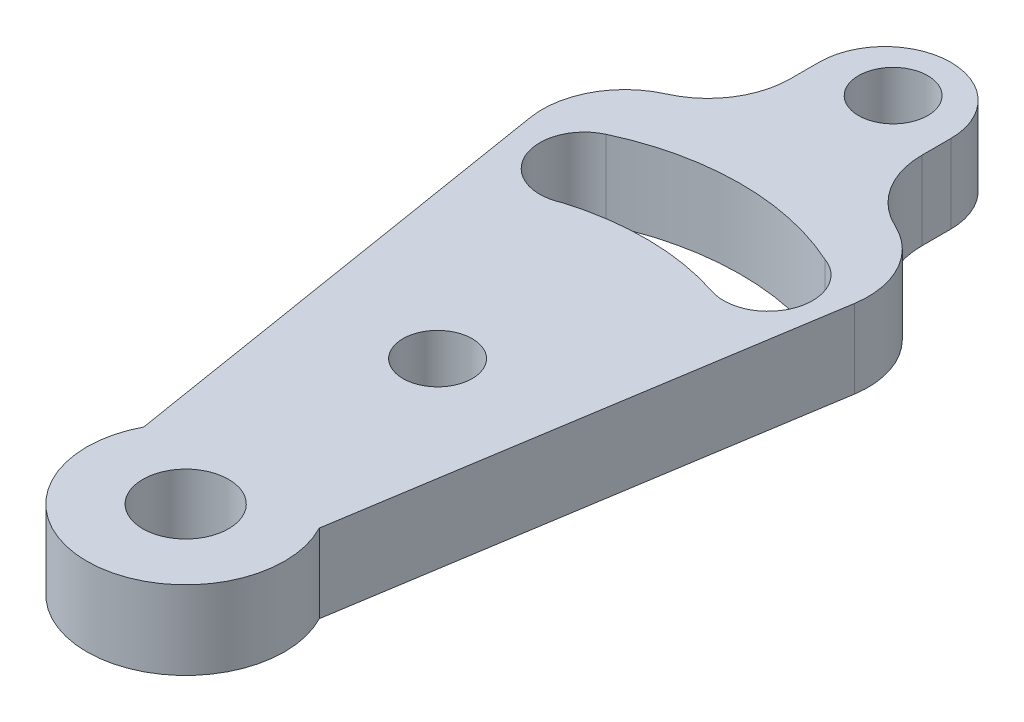
ISO-10303-21;
HEADER;
FILE_DESCRIPTION(('STEP AP214'),'2;1');
FILE_NAME('part.step','',(''),(''),'','','');
FILE_SCHEMA(('AUTOMOTIVE_DESIGN { 1 0 10303 214 1 1 1 1 }'));
ENDSEC;
DATA;
#1=APPLICATION_CONTEXT('core data for automotive mechanical design processes');
#2=APPLICATION_PROTOCOL_DEFINITION('international standard','automotive_design',2000,#1);
#3=PRODUCT_CONTEXT('',#1,'mechanical');
#4=PRODUCT('Part','Part','',(#3));
#5=PRODUCT_RELATED_PRODUCT_CATEGORY('part','',(#4));
#6=PRODUCT_DEFINITION_FORMATION('','',#4);
#7=PRODUCT_DEFINITION_CONTEXT('part definition',#1,'design');
#8=PRODUCT_DEFINITION('design','',#6,#7);
#9=PRODUCT_DEFINITION_SHAPE('','',#8);
#10=(LENGTH_UNIT() NAMED_UNIT(*) SI_UNIT(.MILLI.,.METRE.));
#11=(NAMED_UNIT(*) PLANE_ANGLE_UNIT() SI_UNIT($,.RADIAN.));
#12=(NAMED_UNIT(*) SI_UNIT($,.STERADIAN.) SOLID_ANGLE_UNIT());
#13=UNCERTAINTY_MEASURE_WITH_UNIT(LENGTH_MEASURE(1.E-05),#10,'distance_accuracy_value','');
#14=(GEOMETRIC_REPRESENTATION_CONTEXT(3) GLOBAL_UNCERTAINTY_ASSIGNED_CONTEXT((#13)) GLOBAL_UNIT_ASSIGNED_CONTEXT((#10,
#11,#12)) REPRESENTATION_CONTEXT('',''));
#15=CARTESIAN_POINT('',(0.,0.,0.));
#16=DIRECTION('',(0.,0.,1.));
#17=DIRECTION('',(1.,0.,0.));
#18=AXIS2_PLACEMENT_3D('',#15,#16,#17);
#19=CARTESIAN_POINT('',(-18.8482791708787,2279.62390973945,-526.663757324218));
#20=DIRECTION('',(0.,-1.,0.));
#21=DIRECTION('',(1.,0.,0.));
#22=AXIS2_PLACEMENT_3D('',#19,#20,#21);
#23=CYLINDRICAL_SURFACE('',#22,4.);
#24=CARTESIAN_POINT('',(-18.8482791708786,2274.86140973945,-526.663757324218));
#25=DIRECTION('',(0.,-1.,0.));
#26=DIRECTION('',(1.,0.,0.));
#27=AXIS2_PLACEMENT_3D('',#24,#25,#26);
#28=CIRCLE('',#27,4.);
#29=CARTESIAN_POINT('',(-22.8482791708786,2274.86140973945,-526.663757324218));
#30=VERTEX_POINT('',#29);
#31=CARTESIAN_POINT('',(-14.8482791708786,2274.86140973945,-526.663757324218));
#32=VERTEX_POINT('',#31);
#33=EDGE_CURVE('E171',#30,#32,#28,.T.);
#34=ORIENTED_EDGE('',*,*,#33,.F.);
#35=DIRECTION('',(0.,-1.,0.));
#36=VECTOR('',#35,1.);
#37=CARTESIAN_POINT('',(-22.8482791708787,2279.62390973945,-526.663757324218));
#38=LINE('',#37,#36);
#39=CARTESIAN_POINT('',(-22.8482791708787,2279.62390973945,-526.663757324218));
#40=VERTEX_POINT('',#39);
#41=EDGE_CURVE('E11',#40,#30,#38,.T.);
#42=ORIENTED_EDGE('',*,*,#41,.F.);
#43=CARTESIAN_POINT('',(-18.8482791708787,2279.62390973945,-526.663757324218));
#44=DIRECTION('',(0.,-1.,0.));
#45=DIRECTION('',(1.,0.,0.));
#46=AXIS2_PLACEMENT_3D('',#43,#44,#45);
#47=CIRCLE('',#46,4.);
#48=CARTESIAN_POINT('',(-14.8482791708787,2279.62390973945,-526.663757324218));
#49=VERTEX_POINT('',#48);
#50=EDGE_CURVE('E175',#40,#49,#47,.T.);
#51=ORIENTED_EDGE('',*,*,#50,.T.);
#52=DIRECTION('',(0.,-1.,0.));
#53=VECTOR('',#52,1.);
#54=CARTESIAN_POINT('',(-14.8482791708787,2279.62390973945,-526.663757324218));
#55=LINE('',#54,#53);
#56=EDGE_CURVE('E37',#49,#32,#55,.T.);
#57=ORIENTED_EDGE('',*,*,#56,.T.);
#58=EDGE_LOOP('',(#34,#42,#51,#57));
#59=FACE_BOUND('',#58,.T.);
#60=ADVANCED_FACE('F34',(#59),#23,.T.);
#61=CARTESIAN_POINT('',(-22.8482791708787,2279.62390973945,-524.940713696492));
#62=DIRECTION('',(-1.,0.,0.));
#63=DIRECTION('',(0.,-1.,0.));
#64=AXIS2_PLACEMENT_3D('',#61,#62,#63);
#65=PLANE('',#64);
#66=DIRECTION('',(0.,0.,-1.));
#67=VECTOR('',#66,1.);
#68=CARTESIAN_POINT('',(-22.8482791708786,2274.86140973945,-524.940713696492));
#69=LINE('',#68,#67);
#70=CARTESIAN_POINT('',(-22.8482791708787,2274.86140973945,-524.940713696492));
#71=VERTEX_POINT('',#70);
#72=EDGE_CURVE('E179',#71,#30,#69,.T.);
#73=ORIENTED_EDGE('',*,*,#72,.F.);
#74=DIRECTION('',(0.,-1.,0.));
#75=VECTOR('',#74,1.);
#76=CARTESIAN_POINT('',(-22.8482791708787,2279.62390973945,-524.940713696492));
#77=LINE('',#76,#75);
#78=CARTESIAN_POINT('',(-22.8482791708787,2279.62390973945,-524.940713696492));
#79=VERTEX_POINT('',#78);
#80=EDGE_CURVE('E42',#79,#71,#77,.T.);
#81=ORIENTED_EDGE('',*,*,#80,.F.);
#82=DIRECTION('',(0.,0.,-1.));
#83=VECTOR('',#82,1.);
#84=CARTESIAN_POINT('',(-22.8482791708787,2279.62390973945,-524.940713696492));
#85=LINE('',#84,#83);
#86=EDGE_CURVE('E203',#79,#40,#85,.T.);
#87=ORIENTED_EDGE('',*,*,#86,.T.);
#88=ORIENTED_EDGE('',*,*,#41,.T.);
#89=EDGE_LOOP('',(#73,#81,#87,#88));
#90=FACE_BOUND('',#89,.T.);
#91=ADVANCED_FACE('F258',(#90),#65,.T.);
#92=CARTESIAN_POINT('',(-27.8482791708787,2279.62390973945,-524.940713696492));
#93=DIRECTION('',(0.,-1.,0.));
#94=DIRECTION('',(1.,0.,0.));
#95=AXIS2_PLACEMENT_3D('',#92,#93,#94);
#96=CYLINDRICAL_SURFACE('',#95,4.99999999999991);
#97=CARTESIAN_POINT('',(-27.8482791708786,2274.86140973945,-524.940713696492));
#98=DIRECTION('',(0.,1.,0.));
#99=DIRECTION('',(-1.,0.,0.));
#100=AXIS2_PLACEMENT_3D('',#97,#98,#99);
#101=CIRCLE('',#100,4.99999999999991);
#102=CARTESIAN_POINT('',(-25.8079527000328,2274.86140973945,-520.375949968503));
#103=VERTEX_POINT('',#102);
#104=EDGE_CURVE('E229',#103,#71,#101,.T.);
#105=ORIENTED_EDGE('',*,*,#104,.F.);
#106=DIRECTION('',(0.,-1.,0.));
#107=VECTOR('',#106,1.);
#108=CARTESIAN_POINT('',(-25.8079527000328,2279.62390973945,-520.375949968503));
#109=LINE('',#108,#107);
#110=CARTESIAN_POINT('',(-25.8079527000328,2279.62390973945,-520.375949968503));
#111=VERTEX_POINT('',#110);
#112=EDGE_CURVE('E235',#111,#103,#109,.T.);
#113=ORIENTED_EDGE('',*,*,#112,.F.);
#114=CARTESIAN_POINT('',(-27.8482791708787,2279.62390973945,-524.940713696492));
#115=DIRECTION('',(0.,1.,0.));
#116=DIRECTION('',(-1.,0.,0.));
#117=AXIS2_PLACEMENT_3D('',#114,#115,#116);
#118=CIRCLE('',#117,4.99999999999991);
#119=EDGE_CURVE('E200',#111,#79,#118,.T.);
#120=ORIENTED_EDGE('',*,*,#119,.T.);
#121=ORIENTED_EDGE('',*,*,#80,.T.);
#122=EDGE_LOOP('',(#105,#113,#120,#121));
#123=FACE_BOUND('',#122,.T.);
#124=ADVANCED_FACE('F287',(#123),#96,.F.);
#125=CARTESIAN_POINT('',(-23.767626229187,2279.62390973945,-515.811186240514));
#126=DIRECTION('',(0.,-1.,0.));
#127=DIRECTION('',(1.,0.,0.));
#128=AXIS2_PLACEMENT_3D('',#125,#126,#127);
#129=CYLINDRICAL_SURFACE('',#128,4.99999999999992);
#130=CARTESIAN_POINT('',(-23.7676262291869,2274.86140973945,-515.811186240514));
#131=DIRECTION('',(0.,-1.,0.));
#132=DIRECTION('',(1.,0.,0.));
#133=AXIS2_PLACEMENT_3D('',#130,#131,#132);
#134=CIRCLE('',#133,4.99999999999992);
#135=CARTESIAN_POINT('',(-28.7031764289429,2274.86140973945,-515.010971128379));
#136=VERTEX_POINT('',#135);
#137=EDGE_CURVE('E226',#136,#103,#134,.T.);
#138=ORIENTED_EDGE('',*,*,#137,.F.);
#139=DIRECTION('',(0.,-1.,0.));
#140=VECTOR('',#139,1.);
#141=CARTESIAN_POINT('',(-28.703176428943,2279.62390973945,-515.010971128379));
#142=LINE('',#141,#140);
#143=CARTESIAN_POINT('',(-28.703176428943,2279.62390973945,-515.010971128379));
#144=VERTEX_POINT('',#143);
#145=EDGE_CURVE('E237',#144,#136,#142,.T.);
#146=ORIENTED_EDGE('',*,*,#145,.F.);
#147=CARTESIAN_POINT('',(-23.767626229187,2279.62390973945,-515.811186240514));
#148=DIRECTION('',(0.,-1.,0.));
#149=DIRECTION('',(1.,0.,0.));
#150=AXIS2_PLACEMENT_3D('',#147,#148,#149);
#151=CIRCLE('',#150,4.99999999999992);
#152=EDGE_CURVE('E197',#144,#111,#151,.T.);
#153=ORIENTED_EDGE('',*,*,#152,.T.);
#154=ORIENTED_EDGE('',*,*,#112,.T.);
#155=EDGE_LOOP('',(#138,#146,#153,#154));
#156=FACE_BOUND('',#155,.T.);
#157=ADVANCED_FACE('F285',(#156),#129,.T.);
#158=CARTESIAN_POINT('',(-24.1679375729257,2279.62390973945,-487.0386188167));
#159=DIRECTION('',(-0.987110039951201,0.,0.160043022426906));
#160=DIRECTION('',(0.160043022426906,0.,0.987110039951201));
#161=AXIS2_PLACEMENT_3D('',#158,#159,#160);
#162=PLANE('',#161);
#163=DIRECTION('',(-0.160043022426906,0.,-0.987110039951201));
#164=VECTOR('',#163,1.);
#165=CARTESIAN_POINT('',(-24.1679375729257,2274.86140973945,-487.0386188167));
#166=LINE('',#165,#164);
#167=CARTESIAN_POINT('',(-24.1679375729257,2274.86140973945,-487.0386188167));
#168=VERTEX_POINT('',#167);
#169=EDGE_CURVE('E223',#168,#136,#166,.T.);
#170=ORIENTED_EDGE('',*,*,#169,.F.);
#171=DIRECTION('',(0.,-1.,0.));
#172=VECTOR('',#171,1.);
#173=CARTESIAN_POINT('',(-24.1679375729257,2279.62390973945,-487.0386188167));
#174=LINE('',#173,#172);
#175=CARTESIAN_POINT('',(-24.1679375729257,2279.62390973945,-487.0386188167));
#176=VERTEX_POINT('',#175);
#177=EDGE_CURVE('E239',#176,#168,#174,.T.);
#178=ORIENTED_EDGE('',*,*,#177,.F.);
#179=DIRECTION('',(-0.160043022426906,0.,-0.987110039951201));
#180=VECTOR('',#179,1.);
#181=CARTESIAN_POINT('',(-24.1679375729257,2279.62390973945,-487.0386188167));
#182=LINE('',#181,#180);
#183=EDGE_CURVE('E194',#176,#144,#182,.T.);
#184=ORIENTED_EDGE('',*,*,#183,.T.);
#185=ORIENTED_EDGE('',*,*,#145,.T.);
#186=EDGE_LOOP('',(#170,#178,#184,#185));
#187=FACE_BOUND('',#186,.T.);
#188=ADVANCED_FACE('F281',(#187),#162,.T.);
#189=CARTESIAN_POINT('',(-18.8482791708787,2279.62390973945,-484.26350900166));
#190=DIRECTION('',(0.,-1.,0.));
#191=DIRECTION('',(1.,0.,0.));
#192=AXIS2_PLACEMENT_3D('',#189,#190,#191);
#193=CYLINDRICAL_SURFACE('',#192,6.00000000000001);
#194=CARTESIAN_POINT('',(-18.8482791708786,2274.86140973945,-484.26350900166));
#195=DIRECTION('',(0.,-1.,0.));
#196=DIRECTION('',(1.,0.,0.));
#197=AXIS2_PLACEMENT_3D('',#194,#195,#196);
#198=CIRCLE('',#197,6.00000000000001);
#199=CARTESIAN_POINT('',(-13.5369203045615,2274.86140973945,-487.054470662664));
#200=VERTEX_POINT('',#199);
#201=EDGE_CURVE('E220',#200,#168,#198,.T.);
#202=ORIENTED_EDGE('',*,*,#201,.F.);
#203=DIRECTION('',(0.,-1.,0.));
#204=VECTOR('',#203,1.);
#205=CARTESIAN_POINT('',(-13.5369203045615,2279.62390973945,-487.054470662664));
#206=LINE('',#205,#204);
#207=CARTESIAN_POINT('',(-13.5369203045615,2279.62390973945,-487.054470662664));
#208=VERTEX_POINT('',#207);
#209=EDGE_CURVE('E241',#208,#200,#206,.T.);
#210=ORIENTED_EDGE('',*,*,#209,.F.);
#211=CARTESIAN_POINT('',(-18.8482791708787,2279.62390973945,-484.26350900166));
#212=DIRECTION('',(0.,-1.,0.));
#213=DIRECTION('',(1.,0.,0.));
#214=AXIS2_PLACEMENT_3D('',#211,#212,#213);
#215=CIRCLE('',#214,6.00000000000001);
#216=EDGE_CURVE('E191',#208,#176,#215,.T.);
#217=ORIENTED_EDGE('',*,*,#216,.T.);
#218=ORIENTED_EDGE('',*,*,#177,.T.);
#219=EDGE_LOOP('',(#202,#210,#217,#218));
#220=FACE_BOUND('',#219,.T.);
#221=ADVANCED_FACE('F277',(#220),#193,.T.);
#222=CARTESIAN_POINT('',(-9.107395500212,2279.62390973945,-515.065145403642));
#223=DIRECTION('',(0.987726070211904,0.,0.156196063406699));
#224=DIRECTION('',(0.156196063406699,0.,-0.987726070211904));
#225=AXIS2_PLACEMENT_3D('',#222,#223,#224);
#226=PLANE('',#225);
#227=DIRECTION('',(-0.156196063406699,0.,0.987726070211904));
#228=VECTOR('',#227,1.);
#229=CARTESIAN_POINT('',(-9.10739550021195,2274.86140973945,-515.065145403642));
#230=LINE('',#229,#228);
#231=CARTESIAN_POINT('',(-9.10739550021222,2274.86140973945,-515.065145403642));
#232=VERTEX_POINT('',#231);
#233=EDGE_CURVE('E217',#232,#200,#230,.T.);
#234=ORIENTED_EDGE('',*,*,#233,.F.);
#235=DIRECTION('',(0.,-1.,0.));
#236=VECTOR('',#235,1.);
#237=CARTESIAN_POINT('',(-9.10739550021228,2279.62390973945,-515.065145403642));
#238=LINE('',#237,#236);
#239=CARTESIAN_POINT('',(-9.10739550021228,2279.62390973945,-515.065145403642));
#240=VERTEX_POINT('',#239);
#241=EDGE_CURVE('E243',#240,#232,#238,.T.);
#242=ORIENTED_EDGE('',*,*,#241,.F.);
#243=DIRECTION('',(-0.156196063406699,0.,0.987726070211904));
#244=VECTOR('',#243,1.);
#245=CARTESIAN_POINT('',(-9.107395500212,2279.62390973945,-515.065145403642));
#246=LINE('',#245,#244);
#247=EDGE_CURVE('E188',#240,#208,#246,.T.);
#248=ORIENTED_EDGE('',*,*,#247,.T.);
#249=ORIENTED_EDGE('',*,*,#209,.T.);
#250=EDGE_LOOP('',(#234,#242,#248,#249));
#251=FACE_BOUND('',#250,.T.);
#252=ADVANCED_FACE('F273',(#251),#226,.T.);
#253=CARTESIAN_POINT('',(-14.0460258512716,2279.62390973945,-515.846125720676));
#254=DIRECTION('',(0.,-1.,0.));
#255=DIRECTION('',(1.,0.,0.));
#256=AXIS2_PLACEMENT_3D('',#253,#254,#255);
#257=CYLINDRICAL_SURFACE('',#256,4.99999999999979);
#258=CARTESIAN_POINT('',(-14.0460258512715,2274.86140973945,-515.846125720676));
#259=DIRECTION('',(0.,-1.,0.));
#260=DIRECTION('',(1.,0.,0.));
#261=AXIS2_PLACEMENT_3D('',#258,#259,#260);
#262=CIRCLE('',#261,4.99999999999979);
#263=CARTESIAN_POINT('',(-11.9471525110751,2274.86140973945,-520.384267488163));
#264=VERTEX_POINT('',#263);
#265=EDGE_CURVE('E214',#264,#232,#262,.T.);
#266=ORIENTED_EDGE('',*,*,#265,.F.);
#267=DIRECTION('',(0.,-1.,0.));
#268=VECTOR('',#267,1.);
#269=CARTESIAN_POINT('',(-11.9471525110752,2279.62390973945,-520.384267488163));
#270=LINE('',#269,#268);
#271=CARTESIAN_POINT('',(-11.9471525110752,2279.62390973945,-520.384267488163));
#272=VERTEX_POINT('',#271);
#273=EDGE_CURVE('E245',#272,#264,#270,.T.);
#274=ORIENTED_EDGE('',*,*,#273,.F.);
#275=CARTESIAN_POINT('',(-14.0460258512716,2279.62390973945,-515.846125720676));
#276=DIRECTION('',(0.,-1.,0.));
#277=DIRECTION('',(1.,0.,0.));
#278=AXIS2_PLACEMENT_3D('',#275,#276,#277);
#279=CIRCLE('',#278,4.99999999999979);
#280=EDGE_CURVE('E185',#272,#240,#279,.T.);
#281=ORIENTED_EDGE('',*,*,#280,.T.);
#282=ORIENTED_EDGE('',*,*,#241,.T.);
#283=EDGE_LOOP('',(#266,#274,#281,#282));
#284=FACE_BOUND('',#283,.T.);
#285=ADVANCED_FACE('F271',(#284),#257,.T.);
#286=CARTESIAN_POINT('',(-9.84827917087866,2279.62390973945,-524.92240925565));
#287=DIRECTION('',(0.,-1.,0.));
#288=DIRECTION('',(1.,0.,0.));
#289=AXIS2_PLACEMENT_3D('',#286,#287,#288);
#290=CYLINDRICAL_SURFACE('',#289,5.);
#291=CARTESIAN_POINT('',(-9.8482791708786,2274.86140973945,-524.92240925565));
#292=DIRECTION('',(0.,1.,0.));
#293=DIRECTION('',(-1.,0.,0.));
#294=AXIS2_PLACEMENT_3D('',#291,#292,#293);
#295=CIRCLE('',#294,5.);
#296=CARTESIAN_POINT('',(-14.8482791708786,2274.86140973945,-524.92240925565));
#297=VERTEX_POINT('',#296);
#298=EDGE_CURVE('E211',#297,#264,#295,.T.);
#299=ORIENTED_EDGE('',*,*,#298,.F.);
#300=DIRECTION('',(0.,-1.,0.));
#301=VECTOR('',#300,1.);
#302=CARTESIAN_POINT('',(-14.8482791708787,2279.62390973945,-524.92240925565));
#303=LINE('',#302,#301);
#304=CARTESIAN_POINT('',(-14.8482791708787,2279.62390973945,-524.92240925565));
#305=VERTEX_POINT('',#304);
#306=EDGE_CURVE('E246',#305,#297,#303,.T.);
#307=ORIENTED_EDGE('',*,*,#306,.F.);
#308=CARTESIAN_POINT('',(-9.84827917087866,2279.62390973945,-524.92240925565));
#309=DIRECTION('',(0.,1.,0.));
#310=DIRECTION('',(-1.,0.,0.));
#311=AXIS2_PLACEMENT_3D('',#308,#309,#310);
#312=CIRCLE('',#311,5.);
#313=EDGE_CURVE('E182',#305,#272,#312,.T.);
#314=ORIENTED_EDGE('',*,*,#313,.T.);
#315=ORIENTED_EDGE('',*,*,#273,.T.);
#316=EDGE_LOOP('',(#299,#307,#314,#315));
#317=FACE_BOUND('',#316,.T.);
#318=ADVANCED_FACE('F267',(#317),#290,.F.);
#319=CARTESIAN_POINT('',(-14.8482791708787,2279.62390973945,-526.663757324218));
#320=DIRECTION('',(1.,0.,0.));
#321=DIRECTION('',(0.,1.,0.));
#322=AXIS2_PLACEMENT_3D('',#319,#320,#321);
#323=PLANE('',#322);
#324=DIRECTION('',(0.,0.,1.));
#325=VECTOR('',#324,1.);
#326=CARTESIAN_POINT('',(-14.8482791708786,2274.86140973945,-526.663757324218));
#327=LINE('',#326,#325);
#328=EDGE_CURVE('E208',#32,#297,#327,.T.);
#329=ORIENTED_EDGE('',*,*,#328,.F.);
#330=ORIENTED_EDGE('',*,*,#56,.F.);
#331=DIRECTION('',(0.,0.,1.));
#332=VECTOR('',#331,1.);
#333=CARTESIAN_POINT('',(-14.8482791708787,2279.62390973945,-526.663757324218));
#334=LINE('',#333,#332);
#335=EDGE_CURVE('E178',#49,#305,#334,.T.);
#336=ORIENTED_EDGE('',*,*,#335,.T.);
#337=ORIENTED_EDGE('',*,*,#306,.T.);
#338=EDGE_LOOP('',(#329,#330,#336,#337));
#339=FACE_BOUND('',#338,.T.);
#340=ADVANCED_FACE('F254',(#339),#323,.T.);
#341=CARTESIAN_POINT('',(-18.8482791708787,2279.62390973945,-526.663757324218));
#342=DIRECTION('',(0.,-1.,0.));
#343=DIRECTION('',(1.,0.,0.));
#344=AXIS2_PLACEMENT_3D('',#341,#342,#343);
#345=PLANE('',#344);
#346=CARTESIAN_POINT('',(-18.8482791708786,2279.62390973945,-499.53850900166));
#347=DIRECTION('',(0.,1.,0.));
#348=DIRECTION('',(0.,0.,1.));
#349=AXIS2_PLACEMENT_3D('',#346,#347,#348);
#350=CIRCLE('',#349,2.09999999999998);
#351=CARTESIAN_POINT('',(-18.8482791708786,2279.62390973945,-497.43850900166));
#352=VERTEX_POINT('',#351);
#353=EDGE_CURVE('E464',#352,#352,#350,.T.);
#354=ORIENTED_EDGE('',*,*,#353,.F.);
#355=EDGE_LOOP('',(#354));
#356=FACE_BOUND('',#355,.T.);
#357=CARTESIAN_POINT('',(-18.8482791708786,2279.62390973945,-527.163757324218));
#358=DIRECTION('',(0.,1.,0.));
#359=DIRECTION('',(0.,0.,1.));
#360=AXIS2_PLACEMENT_3D('',#357,#358,#359);
#361=CIRCLE('',#360,2.09999999999998);
#362=CARTESIAN_POINT('',(-18.8482791708786,2279.62390973945,-525.063757324218));
#363=VERTEX_POINT('',#362);
#364=EDGE_CURVE('E466',#363,#363,#361,.T.);
#365=ORIENTED_EDGE('',*,*,#364,.F.);
#366=EDGE_LOOP('',(#365));
#367=FACE_BOUND('',#366,.T.);
#368=CARTESIAN_POINT('',(-18.8482791708786,2279.62390973945,-484.26350900166));
#369=DIRECTION('',(0.,1.,0.));
#370=DIRECTION('',(0.,0.,1.));
#371=AXIS2_PLACEMENT_3D('',#368,#369,#370);
#372=CIRCLE('',#371,2.60000000000004);
#373=CARTESIAN_POINT('',(-18.8482791708786,2279.62390973945,-481.66350900166));
#374=VERTEX_POINT('',#373);
#375=EDGE_CURVE('E473',#374,#374,#372,.T.);
#376=ORIENTED_EDGE('',*,*,#375,.F.);
#377=EDGE_LOOP('',(#376));
#378=FACE_BOUND('',#377,.T.);
#379=CARTESIAN_POINT('',(-18.8482791708786,2279.62390973945,-496.91350900166));
#380=DIRECTION('',(0.,-1.,0.));
#381=DIRECTION('',(1.,0.,0.));
#382=AXIS2_PLACEMENT_3D('',#379,#380,#381);
#383=CIRCLE('',#382,15.2500000000001);
#384=CARTESIAN_POINT('',(-23.2329343558627,2279.62390973945,-511.519579620029));
#385=VERTEX_POINT('',#384);
#386=CARTESIAN_POINT('',(-14.1041751045666,2279.62390973945,-511.406816995628));
#387=VERTEX_POINT('',#386);
#388=EDGE_CURVE('E165',#385,#387,#383,.T.);
#389=ORIENTED_EDGE('',*,*,#388,.F.);
#390=CARTESIAN_POINT('',(-24.3823968449703,2279.62390973945,-513.972327160611));
#391=DIRECTION('',(0.,1.,0.));
#392=DIRECTION('',(-1.,0.,0.));
#393=AXIS2_PLACEMENT_3D('',#390,#391,#392);
#394=CIRCLE('',#393,2.70873300856587);
#395=CARTESIAN_POINT('',(-25.5318593340788,2279.62390973945,-516.425074701192));
#396=VERTEX_POINT('',#395);
#397=EDGE_CURVE('E50',#396,#385,#394,.T.);
#398=ORIENTED_EDGE('',*,*,#397,.F.);
#399=CARTESIAN_POINT('',(-18.8482791708786,2279.62390973945,-502.16350900166));
#400=DIRECTION('',(0.,1.,0.));
#401=DIRECTION('',(-1.,0.,0.));
#402=AXIS2_PLACEMENT_3D('',#399,#400,#401);
#403=CIRCLE('',#402,15.75);
#404=CARTESIAN_POINT('',(-12.3344634027556,2279.62390973945,-516.503408029859));
#405=VERTEX_POINT('',#404);
#406=EDGE_CURVE('E153',#405,#396,#403,.T.);
#407=ORIENTED_EDGE('',*,*,#406,.F.);
#408=CARTESIAN_POINT('',(-13.2193192536598,2279.62390973945,-513.955112512743));
#409=DIRECTION('',(0.,1.,0.));
#410=DIRECTION('',(-1.,0.,0.));
#411=AXIS2_PLACEMENT_3D('',#408,#409,#410);
#412=CIRCLE('',#411,2.69755072601689);
#413=EDGE_CURVE('E156',#387,#405,#412,.T.);
#414=ORIENTED_EDGE('',*,*,#413,.F.);
#415=EDGE_LOOP('',(#389,#398,#407,#414));
#416=FACE_BOUND('',#415,.T.);
#417=ORIENTED_EDGE('',*,*,#50,.F.);
#418=ORIENTED_EDGE('',*,*,#86,.F.);
#419=ORIENTED_EDGE('',*,*,#119,.F.);
#420=ORIENTED_EDGE('',*,*,#152,.F.);
#421=ORIENTED_EDGE('',*,*,#183,.F.);
#422=ORIENTED_EDGE('',*,*,#216,.F.);
#423=ORIENTED_EDGE('',*,*,#247,.F.);
#424=ORIENTED_EDGE('',*,*,#280,.F.);
#425=ORIENTED_EDGE('',*,*,#313,.F.);
#426=ORIENTED_EDGE('',*,*,#335,.F.);
#427=EDGE_LOOP('',(#417,#418,#419,#420,#421,#422,#423,#424,#425,#426));
#428=FACE_BOUND('',#427,.T.);
#429=ADVANCED_FACE('F261',(#356,#367,#378,#416,#428),#345,.F.);
#430=CARTESIAN_POINT('',(-18.8482791708786,2274.86140973945,-526.663757324218));
#431=DIRECTION('',(0.,-1.,0.));
#432=DIRECTION('',(1.,0.,0.));
#433=AXIS2_PLACEMENT_3D('',#430,#431,#432);
#434=PLANE('',#433);
#435=CARTESIAN_POINT('',(-18.8482791708786,2274.86140973945,-499.53850900166));
#436=DIRECTION('',(0.,1.,0.));
#437=DIRECTION('',(0.,0.,1.));
#438=AXIS2_PLACEMENT_3D('',#435,#436,#437);
#439=CIRCLE('',#438,2.09999999999998);
#440=CARTESIAN_POINT('',(-18.8482791708786,2274.86140973945,-497.43850900166));
#441=VERTEX_POINT('',#440);
#442=EDGE_CURVE('E461',#441,#441,#439,.T.);
#443=ORIENTED_EDGE('',*,*,#442,.T.);
#444=EDGE_LOOP('',(#443));
#445=FACE_BOUND('',#444,.T.);
#446=CARTESIAN_POINT('',(-18.8482791708786,2274.86140973945,-527.163757324218));
#447=DIRECTION('',(0.,1.,0.));
#448=DIRECTION('',(0.,0.,1.));
#449=AXIS2_PLACEMENT_3D('',#446,#447,#448);
#450=CIRCLE('',#449,2.09999999999998);
#451=CARTESIAN_POINT('',(-18.8482791708786,2274.86140973945,-525.063757324218));
#452=VERTEX_POINT('',#451);
#453=EDGE_CURVE('E471',#452,#452,#450,.T.);
#454=ORIENTED_EDGE('',*,*,#453,.T.);
#455=EDGE_LOOP('',(#454));
#456=FACE_BOUND('',#455,.T.);
#457=CARTESIAN_POINT('',(-18.8482791708786,2274.86140973945,-484.26350900166));
#458=DIRECTION('',(0.,1.,0.));
#459=DIRECTION('',(0.,0.,1.));
#460=AXIS2_PLACEMENT_3D('',#457,#458,#459);
#461=CIRCLE('',#460,2.60000000000003);
#462=CARTESIAN_POINT('',(-18.8482791708786,2274.86140973945,-481.66350900166));
#463=VERTEX_POINT('',#462);
#464=EDGE_CURVE('E159',#463,#463,#461,.T.);
#465=ORIENTED_EDGE('',*,*,#464,.T.);
#466=EDGE_LOOP('',(#465));
#467=FACE_BOUND('',#466,.T.);
#468=CARTESIAN_POINT('',(-24.3823968449703,2274.86140973945,-513.972327160611));
#469=DIRECTION('',(0.,1.,0.));
#470=DIRECTION('',(-1.,0.,0.));
#471=AXIS2_PLACEMENT_3D('',#468,#469,#470);
#472=CIRCLE('',#471,2.70873300856587);
#473=CARTESIAN_POINT('',(-25.5318593340787,2274.86140973945,-516.425074701192));
#474=VERTEX_POINT('',#473);
#475=CARTESIAN_POINT('',(-23.2329343558626,2274.86140973945,-511.519579620029));
#476=VERTEX_POINT('',#475);
#477=EDGE_CURVE('E137',#474,#476,#472,.T.);
#478=ORIENTED_EDGE('',*,*,#477,.T.);
#479=CARTESIAN_POINT('',(-18.8482791708786,2274.86140973945,-496.91350900166));
#480=DIRECTION('',(0.,-1.,0.));
#481=DIRECTION('',(1.,0.,0.));
#482=AXIS2_PLACEMENT_3D('',#479,#480,#481);
#483=CIRCLE('',#482,15.2500000000001);
#484=CARTESIAN_POINT('',(-14.1041751045665,2274.86140973945,-511.406816995628));
#485=VERTEX_POINT('',#484);
#486=EDGE_CURVE('E146',#476,#485,#483,.T.);
#487=ORIENTED_EDGE('',*,*,#486,.T.);
#488=CARTESIAN_POINT('',(-13.2193192536598,2274.86140973945,-513.955112512743));
#489=DIRECTION('',(0.,1.,0.));
#490=DIRECTION('',(-1.,0.,0.));
#491=AXIS2_PLACEMENT_3D('',#488,#489,#490);
#492=CIRCLE('',#491,2.69755072601689);
#493=CARTESIAN_POINT('',(-12.3344634027556,2274.86140973945,-516.503408029859));
#494=VERTEX_POINT('',#493);
#495=EDGE_CURVE('E58',#485,#494,#492,.T.);
#496=ORIENTED_EDGE('',*,*,#495,.T.);
#497=CARTESIAN_POINT('',(-18.8482791708786,2274.86140973945,-502.16350900166));
#498=DIRECTION('',(0.,1.,0.));
#499=DIRECTION('',(-1.,0.,0.));
#500=AXIS2_PLACEMENT_3D('',#497,#498,#499);
#501=CIRCLE('',#500,15.75);
#502=EDGE_CURVE('E143',#494,#474,#501,.T.);
#503=ORIENTED_EDGE('',*,*,#502,.T.);
#504=EDGE_LOOP('',(#478,#487,#496,#503));
#505=FACE_BOUND('',#504,.T.);
#506=ORIENTED_EDGE('',*,*,#33,.T.);
#507=ORIENTED_EDGE('',*,*,#328,.T.);
#508=ORIENTED_EDGE('',*,*,#298,.T.);
#509=ORIENTED_EDGE('',*,*,#265,.T.);
#510=ORIENTED_EDGE('',*,*,#233,.T.);
#511=ORIENTED_EDGE('',*,*,#201,.T.);
#512=ORIENTED_EDGE('',*,*,#169,.T.);
#513=ORIENTED_EDGE('',*,*,#137,.T.);
#514=ORIENTED_EDGE('',*,*,#104,.T.);
#515=ORIENTED_EDGE('',*,*,#72,.T.);
#516=EDGE_LOOP('',(#506,#507,#508,#509,#510,#511,#512,#513,#514,#515));
#517=FACE_BOUND('',#516,.T.);
#518=ADVANCED_FACE('F150',(#445,#456,#467,#505,#517),#434,.T.);
#519=CARTESIAN_POINT('',(-24.3823968449703,2274.86140973945,-513.972327160611));
#520=DIRECTION('',(0.,1.,0.));
#521=DIRECTION('',(-1.,0.,0.));
#522=AXIS2_PLACEMENT_3D('',#519,#520,#521);
#523=CYLINDRICAL_SURFACE('',#522,2.70873300856587);
#524=ORIENTED_EDGE('',*,*,#397,.T.);
#525=DIRECTION('',(0.,1.,0.));
#526=VECTOR('',#525,1.);
#527=CARTESIAN_POINT('',(-23.2329343558626,2274.86140973945,-511.519579620029));
#528=LINE('',#527,#526);
#529=EDGE_CURVE('E133',#476,#385,#528,.T.);
#530=ORIENTED_EDGE('',*,*,#529,.F.);
#531=ORIENTED_EDGE('',*,*,#477,.F.);
#532=DIRECTION('',(0.,1.,0.));
#533=VECTOR('',#532,1.);
#534=CARTESIAN_POINT('',(-25.5318593340787,2274.86140973945,-516.425074701192));
#535=LINE('',#534,#533);
#536=EDGE_CURVE('E169',#474,#396,#535,.T.);
#537=ORIENTED_EDGE('',*,*,#536,.T.);
#538=EDGE_LOOP('',(#524,#530,#531,#537));
#539=FACE_BOUND('',#538,.T.);
#540=ADVANCED_FACE('F135',(#539),#523,.F.);
#541=CARTESIAN_POINT('',(-18.8482791708786,2274.86140973945,-502.16350900166));
#542=DIRECTION('',(0.,1.,0.));
#543=DIRECTION('',(-1.,0.,0.));
#544=AXIS2_PLACEMENT_3D('',#541,#542,#543);
#545=CYLINDRICAL_SURFACE('',#544,15.75);
#546=ORIENTED_EDGE('',*,*,#406,.T.);
#547=ORIENTED_EDGE('',*,*,#536,.F.);
#548=ORIENTED_EDGE('',*,*,#502,.F.);
#549=DIRECTION('',(0.,1.,0.));
#550=VECTOR('',#549,1.);
#551=CARTESIAN_POINT('',(-12.3344634027556,2274.86140973945,-516.503408029859));
#552=LINE('',#551,#550);
#553=EDGE_CURVE('E172',#494,#405,#552,.T.);
#554=ORIENTED_EDGE('',*,*,#553,.T.);
#555=EDGE_LOOP('',(#546,#547,#548,#554));
#556=FACE_BOUND('',#555,.T.);
#557=ADVANCED_FACE('F380',(#556),#545,.F.);
#558=CARTESIAN_POINT('',(-13.2193192536598,2274.86140973945,-513.955112512743));
#559=DIRECTION('',(0.,1.,0.));
#560=DIRECTION('',(-1.,0.,0.));
#561=AXIS2_PLACEMENT_3D('',#558,#559,#560);
#562=CYLINDRICAL_SURFACE('',#561,2.69755072601689);
#563=ORIENTED_EDGE('',*,*,#413,.T.);
#564=ORIENTED_EDGE('',*,*,#553,.F.);
#565=ORIENTED_EDGE('',*,*,#495,.F.);
#566=DIRECTION('',(0.,1.,0.));
#567=VECTOR('',#566,1.);
#568=CARTESIAN_POINT('',(-14.1041751045665,2274.86140973945,-511.406816995628));
#569=LINE('',#568,#567);
#570=EDGE_CURVE('E142',#485,#387,#569,.T.);
#571=ORIENTED_EDGE('',*,*,#570,.T.);
#572=EDGE_LOOP('',(#563,#564,#565,#571));
#573=FACE_BOUND('',#572,.T.);
#574=ADVANCED_FACE('F391',(#573),#562,.F.);
#575=CARTESIAN_POINT('',(-18.8482791708786,2274.86140973945,-496.91350900166));
#576=DIRECTION('',(0.,1.,0.));
#577=DIRECTION('',(-1.,0.,0.));
#578=AXIS2_PLACEMENT_3D('',#575,#576,#577);
#579=CYLINDRICAL_SURFACE('',#578,15.2500000000001);
#580=ORIENTED_EDGE('',*,*,#388,.T.);
#581=ORIENTED_EDGE('',*,*,#570,.F.);
#582=ORIENTED_EDGE('',*,*,#486,.F.);
#583=ORIENTED_EDGE('',*,*,#529,.T.);
#584=EDGE_LOOP('',(#580,#581,#582,#583));
#585=FACE_BOUND('',#584,.T.);
#586=ADVANCED_FACE('F147',(#585),#579,.T.);
#587=CARTESIAN_POINT('',(-18.8482791708786,2279.62390973945,-484.26350900166));
#588=DIRECTION('',(0.,1.,0.));
#589=DIRECTION('',(0.,0.,1.));
#590=AXIS2_PLACEMENT_3D('',#587,#588,#589);
#591=CYLINDRICAL_SURFACE('',#590,2.60000000000003);
#592=ORIENTED_EDGE('',*,*,#464,.F.);
#593=EDGE_LOOP('',(#592));
#594=FACE_BOUND('',#593,.T.);
#595=ORIENTED_EDGE('',*,*,#375,.T.);
#596=EDGE_LOOP('',(#595));
#597=FACE_BOUND('',#596,.T.);
#598=ADVANCED_FACE('F409',(#594,#597),#591,.F.);
#599=CARTESIAN_POINT('',(-18.8482791708786,2279.62390973945,-527.163757324218));
#600=DIRECTION('',(0.,1.,0.));
#601=DIRECTION('',(0.,0.,1.));
#602=AXIS2_PLACEMENT_3D('',#599,#600,#601);
#603=CYLINDRICAL_SURFACE('',#602,2.09999999999998);
#604=ORIENTED_EDGE('',*,*,#453,.F.);
#605=EDGE_LOOP('',(#604));
#606=FACE_BOUND('',#605,.T.);
#607=ORIENTED_EDGE('',*,*,#364,.T.);
#608=EDGE_LOOP('',(#607));
#609=FACE_BOUND('',#608,.T.);
#610=ADVANCED_FACE('F418',(#606,#609),#603,.F.);
#611=CARTESIAN_POINT('',(-18.8482791708786,2279.62390973945,-499.53850900166));
#612=DIRECTION('',(0.,1.,0.));
#613=DIRECTION('',(0.,0.,1.));
#614=AXIS2_PLACEMENT_3D('',#611,#612,#613);
#615=CYLINDRICAL_SURFACE('',#614,2.09999999999998);
#616=ORIENTED_EDGE('',*,*,#442,.F.);
#617=EDGE_LOOP('',(#616));
#618=FACE_BOUND('',#617,.T.);
#619=ORIENTED_EDGE('',*,*,#353,.T.);
#620=EDGE_LOOP('',(#619));
#621=FACE_BOUND('',#620,.T.);
#622=ADVANCED_FACE('F444',(#618,#621),#615,.F.);
#623=CLOSED_SHELL('',(#60,#91,#124,#157,#188,#221,#252,#285,#318,#340,#429,#518,#540,#557,#574,
#586,#598,#610,#622));
#624=MANIFOLD_SOLID_BREP('B2',#623);
#625=ADVANCED_BREP_SHAPE_REPRESENTATION('',(#18,#624),#14);
#626=SHAPE_DEFINITION_REPRESENTATION(#9,#625);
ENDSEC;
END-ISO-10303-21;
